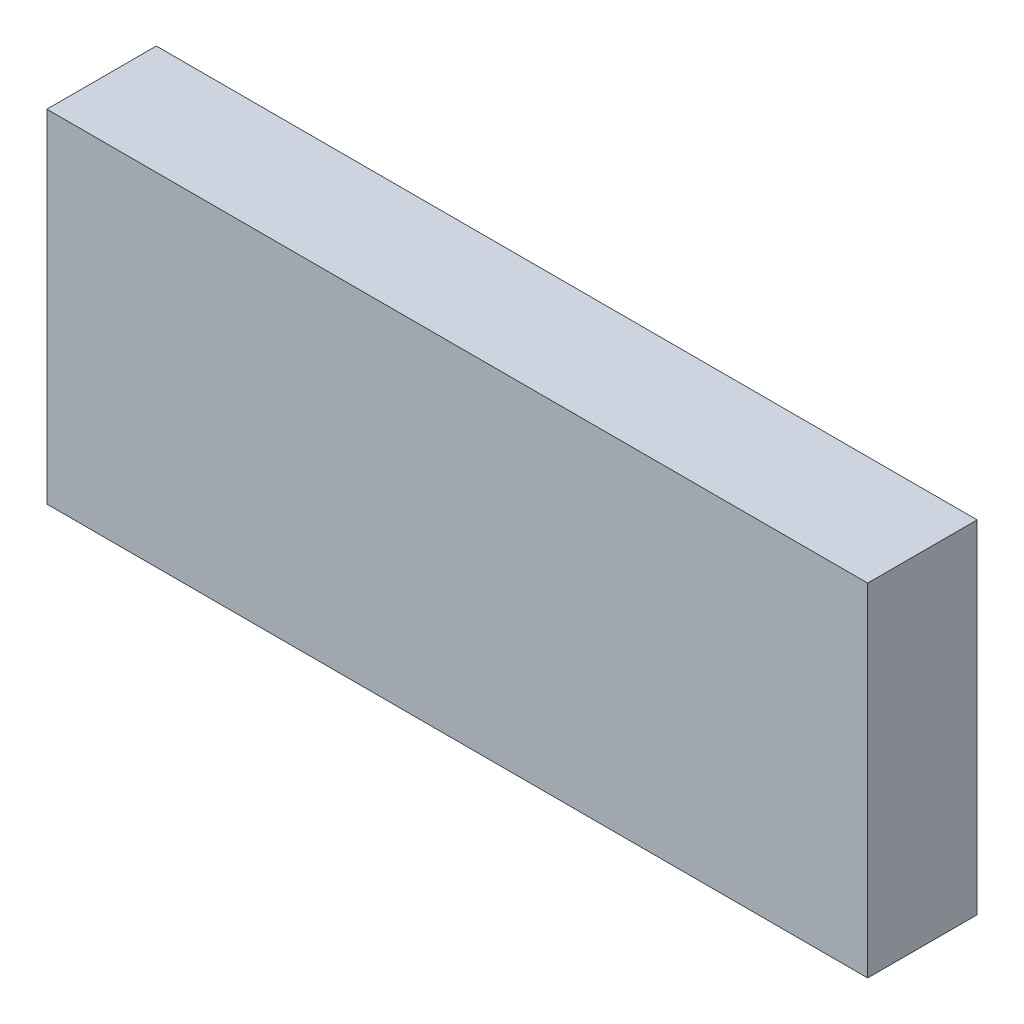
ISO-10303-21;
HEADER;
FILE_DESCRIPTION(('STEP AP214'),'2;1');
FILE_NAME('part.step','',(''),(''),'','','');
FILE_SCHEMA(('AUTOMOTIVE_DESIGN { 1 0 10303 214 1 1 1 1 }'));
ENDSEC;
DATA;
#1=APPLICATION_CONTEXT('core data for automotive mechanical design processes');
#2=APPLICATION_PROTOCOL_DEFINITION('international standard','automotive_design',2000,#1);
#3=PRODUCT_CONTEXT('',#1,'mechanical');
#4=PRODUCT('Part','Part','',(#3));
#5=PRODUCT_RELATED_PRODUCT_CATEGORY('part','',(#4));
#6=PRODUCT_DEFINITION_FORMATION('','',#4);
#7=PRODUCT_DEFINITION_CONTEXT('part definition',#1,'design');
#8=PRODUCT_DEFINITION('design','',#6,#7);
#9=PRODUCT_DEFINITION_SHAPE('','',#8);
#10=(LENGTH_UNIT() NAMED_UNIT(*) SI_UNIT(.MILLI.,.METRE.));
#11=(NAMED_UNIT(*) PLANE_ANGLE_UNIT() SI_UNIT($,.RADIAN.));
#12=(NAMED_UNIT(*) SI_UNIT($,.STERADIAN.) SOLID_ANGLE_UNIT());
#13=UNCERTAINTY_MEASURE_WITH_UNIT(LENGTH_MEASURE(1.E-05),#10,'distance_accuracy_value','');
#14=(GEOMETRIC_REPRESENTATION_CONTEXT(3) GLOBAL_UNCERTAINTY_ASSIGNED_CONTEXT((#13)) GLOBAL_UNIT_ASSIGNED_CONTEXT((#10,
#11,#12)) REPRESENTATION_CONTEXT('',''));
#15=CARTESIAN_POINT('',(0.,0.,0.));
#16=DIRECTION('',(0.,0.,1.));
#17=DIRECTION('',(1.,0.,0.));
#18=AXIS2_PLACEMENT_3D('',#15,#16,#17);
#19=CARTESIAN_POINT('',(90.,-37.5,24.));
#20=DIRECTION('',(-1.,0.,0.));
#21=DIRECTION('',(0.,0.,1.));
#22=AXIS2_PLACEMENT_3D('',#19,#20,#21);
#23=PLANE('',#22);
#24=DIRECTION('',(0.,1.,0.));
#25=VECTOR('',#24,1.);
#26=CARTESIAN_POINT('',(90.,-37.5,0.));
#27=LINE('',#26,#25);
#28=CARTESIAN_POINT('',(90.,-37.5,0.));
#29=VERTEX_POINT('',#28);
#30=CARTESIAN_POINT('',(90.,37.5,0.));
#31=VERTEX_POINT('',#30);
#32=EDGE_CURVE('E95',#29,#31,#27,.T.);
#33=ORIENTED_EDGE('',*,*,#32,.T.);
#34=DIRECTION('',(0.,0.,-1.));
#35=VECTOR('',#34,1.);
#36=CARTESIAN_POINT('',(90.,37.5,24.));
#37=LINE('',#36,#35);
#38=CARTESIAN_POINT('',(90.,37.5,24.));
#39=VERTEX_POINT('',#38);
#40=EDGE_CURVE('E11',#39,#31,#37,.T.);
#41=ORIENTED_EDGE('',*,*,#40,.F.);
#42=DIRECTION('',(0.,1.,0.));
#43=VECTOR('',#42,1.);
#44=CARTESIAN_POINT('',(90.,-37.5,24.));
#45=LINE('',#44,#43);
#46=CARTESIAN_POINT('',(90.,-37.5,24.));
#47=VERTEX_POINT('',#46);
#48=EDGE_CURVE('E83',#47,#39,#45,.T.);
#49=ORIENTED_EDGE('',*,*,#48,.F.);
#50=DIRECTION('',(0.,0.,-1.));
#51=VECTOR('',#50,1.);
#52=CARTESIAN_POINT('',(90.,-37.5,24.));
#53=LINE('',#52,#51);
#54=EDGE_CURVE('E91',#47,#29,#53,.T.);
#55=ORIENTED_EDGE('',*,*,#54,.T.);
#56=EDGE_LOOP('',(#33,#41,#49,#55));
#57=FACE_BOUND('',#56,.T.);
#58=ADVANCED_FACE('F32',(#57),#23,.F.);
#59=CARTESIAN_POINT('',(-90.,37.5,24.));
#60=DIRECTION('',(0.,-1.,0.));
#61=DIRECTION('',(0.,0.,-1.));
#62=AXIS2_PLACEMENT_3D('',#59,#60,#61);
#63=PLANE('',#62);
#64=DIRECTION('',(-1.,0.,0.));
#65=VECTOR('',#64,1.);
#66=CARTESIAN_POINT('',(-90.,37.5,0.));
#67=LINE('',#66,#65);
#68=CARTESIAN_POINT('',(-90.,37.5,0.));
#69=VERTEX_POINT('',#68);
#70=EDGE_CURVE('E87',#31,#69,#67,.T.);
#71=ORIENTED_EDGE('',*,*,#70,.T.);
#72=DIRECTION('',(0.,0.,-1.));
#73=VECTOR('',#72,1.);
#74=CARTESIAN_POINT('',(-90.,37.5,24.));
#75=LINE('',#74,#73);
#76=CARTESIAN_POINT('',(-90.,37.5,24.));
#77=VERTEX_POINT('',#76);
#78=EDGE_CURVE('E40',#77,#69,#75,.T.);
#79=ORIENTED_EDGE('',*,*,#78,.F.);
#80=DIRECTION('',(-1.,0.,0.));
#81=VECTOR('',#80,1.);
#82=CARTESIAN_POINT('',(-90.,37.5,24.));
#83=LINE('',#82,#81);
#84=EDGE_CURVE('E78',#39,#77,#83,.T.);
#85=ORIENTED_EDGE('',*,*,#84,.F.);
#86=ORIENTED_EDGE('',*,*,#40,.T.);
#87=EDGE_LOOP('',(#71,#79,#85,#86));
#88=FACE_BOUND('',#87,.T.);
#89=ADVANCED_FACE('F86',(#88),#63,.F.);
#90=CARTESIAN_POINT('',(-90.,-37.5,24.));
#91=DIRECTION('',(1.,0.,0.));
#92=DIRECTION('',(0.,0.,-1.));
#93=AXIS2_PLACEMENT_3D('',#90,#91,#92);
#94=PLANE('',#93);
#95=DIRECTION('',(0.,-1.,0.));
#96=VECTOR('',#95,1.);
#97=CARTESIAN_POINT('',(-90.,-37.5,0.));
#98=LINE('',#97,#96);
#99=CARTESIAN_POINT('',(-90.,-37.5,0.));
#100=VERTEX_POINT('',#99);
#101=EDGE_CURVE('E65',#69,#100,#98,.T.);
#102=ORIENTED_EDGE('',*,*,#101,.T.);
#103=DIRECTION('',(0.,0.,-1.));
#104=VECTOR('',#103,1.);
#105=CARTESIAN_POINT('',(-90.,-37.5,24.));
#106=LINE('',#105,#104);
#107=CARTESIAN_POINT('',(-90.,-37.5,24.));
#108=VERTEX_POINT('',#107);
#109=EDGE_CURVE('E88',#108,#100,#106,.T.);
#110=ORIENTED_EDGE('',*,*,#109,.F.);
#111=DIRECTION('',(0.,-1.,0.));
#112=VECTOR('',#111,1.);
#113=CARTESIAN_POINT('',(-90.,-37.5,24.));
#114=LINE('',#113,#112);
#115=EDGE_CURVE('E81',#77,#108,#114,.T.);
#116=ORIENTED_EDGE('',*,*,#115,.F.);
#117=ORIENTED_EDGE('',*,*,#78,.T.);
#118=EDGE_LOOP('',(#102,#110,#116,#117));
#119=FACE_BOUND('',#118,.T.);
#120=ADVANCED_FACE('F89',(#119),#94,.F.);
#121=CARTESIAN_POINT('',(-90.,-37.5,24.));
#122=DIRECTION('',(0.,1.,0.));
#123=DIRECTION('',(0.,0.,1.));
#124=AXIS2_PLACEMENT_3D('',#121,#122,#123);
#125=PLANE('',#124);
#126=DIRECTION('',(1.,0.,0.));
#127=VECTOR('',#126,1.);
#128=CARTESIAN_POINT('',(-90.,-37.5,0.));
#129=LINE('',#128,#127);
#130=EDGE_CURVE('E71',#100,#29,#129,.T.);
#131=ORIENTED_EDGE('',*,*,#130,.T.);
#132=ORIENTED_EDGE('',*,*,#54,.F.);
#133=DIRECTION('',(1.,0.,0.));
#134=VECTOR('',#133,1.);
#135=CARTESIAN_POINT('',(-90.,-37.5,24.));
#136=LINE('',#135,#134);
#137=EDGE_CURVE('E48',#108,#47,#136,.T.);
#138=ORIENTED_EDGE('',*,*,#137,.F.);
#139=ORIENTED_EDGE('',*,*,#109,.T.);
#140=EDGE_LOOP('',(#131,#132,#138,#139));
#141=FACE_BOUND('',#140,.T.);
#142=ADVANCED_FACE('F102',(#141),#125,.F.);
#143=CARTESIAN_POINT('',(0.,0.,24.));
#144=DIRECTION('',(0.,0.,-1.));
#145=DIRECTION('',(-1.,0.,0.));
#146=AXIS2_PLACEMENT_3D('',#143,#144,#145);
#147=PLANE('',#146);
#148=ORIENTED_EDGE('',*,*,#48,.T.);
#149=ORIENTED_EDGE('',*,*,#84,.T.);
#150=ORIENTED_EDGE('',*,*,#115,.T.);
#151=ORIENTED_EDGE('',*,*,#137,.T.);
#152=EDGE_LOOP('',(#148,#149,#150,#151));
#153=FACE_BOUND('',#152,.T.);
#154=ADVANCED_FACE('F79',(#153),#147,.F.);
#155=CARTESIAN_POINT('',(0.,0.,0.));
#156=DIRECTION('',(0.,0.,-1.));
#157=DIRECTION('',(-1.,0.,0.));
#158=AXIS2_PLACEMENT_3D('',#155,#156,#157);
#159=PLANE('',#158);
#160=ORIENTED_EDGE('',*,*,#32,.F.);
#161=ORIENTED_EDGE('',*,*,#130,.F.);
#162=ORIENTED_EDGE('',*,*,#101,.F.);
#163=ORIENTED_EDGE('',*,*,#70,.F.);
#164=EDGE_LOOP('',(#160,#161,#162,#163));
#165=FACE_BOUND('',#164,.T.);
#166=ADVANCED_FACE('F105',(#165),#159,.T.);
#167=CLOSED_SHELL('',(#58,#89,#120,#142,#154,#166));
#168=MANIFOLD_SOLID_BREP('B2',#167);
#169=ADVANCED_BREP_SHAPE_REPRESENTATION('',(#18,#168),#14);
#170=SHAPE_DEFINITION_REPRESENTATION(#9,#169);
ENDSEC;
END-ISO-10303-21;
